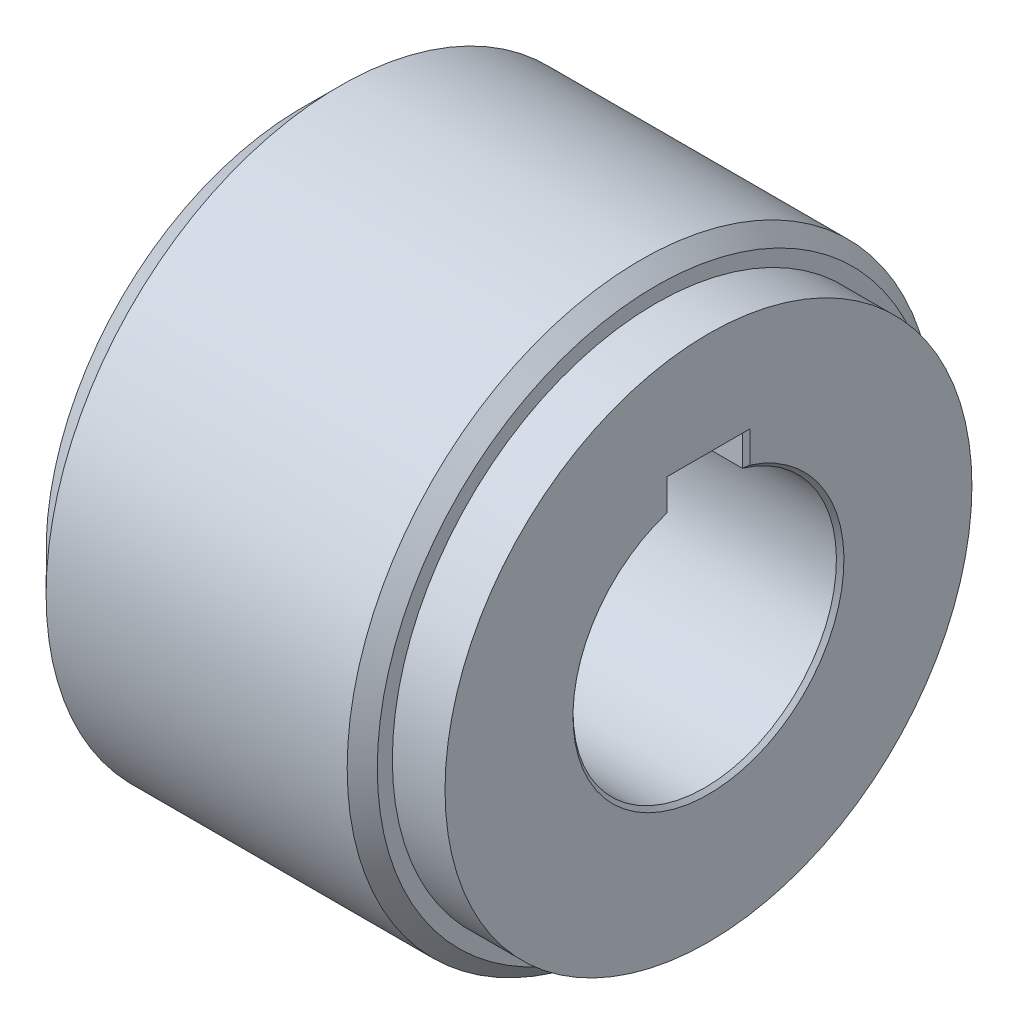
ISO-10303-21;
HEADER;
FILE_DESCRIPTION(('STEP AP214'),'2;1');
FILE_NAME('part.step','',(''),(''),'','','');
FILE_SCHEMA(('AUTOMOTIVE_DESIGN { 1 0 10303 214 1 1 1 1 }'));
ENDSEC;
DATA;
#1=APPLICATION_CONTEXT('core data for automotive mechanical design processes');
#2=APPLICATION_PROTOCOL_DEFINITION('international standard','automotive_design',2000,#1);
#3=PRODUCT_CONTEXT('',#1,'mechanical');
#4=PRODUCT('Part','Part','',(#3));
#5=PRODUCT_RELATED_PRODUCT_CATEGORY('part','',(#4));
#6=PRODUCT_DEFINITION_FORMATION('','',#4);
#7=PRODUCT_DEFINITION_CONTEXT('part definition',#1,'design');
#8=PRODUCT_DEFINITION('design','',#6,#7);
#9=PRODUCT_DEFINITION_SHAPE('','',#8);
#10=(LENGTH_UNIT() NAMED_UNIT(*) SI_UNIT(.MILLI.,.METRE.));
#11=(NAMED_UNIT(*) PLANE_ANGLE_UNIT() SI_UNIT($,.RADIAN.));
#12=(NAMED_UNIT(*) SI_UNIT($,.STERADIAN.) SOLID_ANGLE_UNIT());
#13=UNCERTAINTY_MEASURE_WITH_UNIT(LENGTH_MEASURE(1.E-05),#10,'distance_accuracy_value','');
#14=(GEOMETRIC_REPRESENTATION_CONTEXT(3) GLOBAL_UNCERTAINTY_ASSIGNED_CONTEXT((#13)) GLOBAL_UNIT_ASSIGNED_CONTEXT((#10,
#11,#12)) REPRESENTATION_CONTEXT('',''));
#15=CARTESIAN_POINT('',(0.,0.,0.));
#16=DIRECTION('',(0.,0.,1.));
#17=DIRECTION('',(1.,0.,0.));
#18=AXIS2_PLACEMENT_3D('',#15,#16,#17);
#19=CARTESIAN_POINT('',(27.,0.,0.));
#20=DIRECTION('',(1.,0.,0.));
#21=DIRECTION('',(0.,0.,-1.));
#22=AXIS2_PLACEMENT_3D('',#19,#20,#21);
#23=PLANE('',#22);
#24=DIRECTION('',(0.,0.,-1.));
#25=VECTOR('',#24,1.);
#26=CARTESIAN_POINT('',(27.,21.3,0.));
#27=LINE('',#26,#25);
#28=CARTESIAN_POINT('',(27.,21.3,5.5));
#29=VERTEX_POINT('',#28);
#30=CARTESIAN_POINT('',(27.,21.3,-5.5));
#31=VERTEX_POINT('',#30);
#32=EDGE_CURVE('E157',#29,#31,#27,.T.);
#33=ORIENTED_EDGE('',*,*,#32,.T.);
#34=DIRECTION('',(0.,-1.,0.));
#35=VECTOR('',#34,1.);
#36=CARTESIAN_POINT('',(27.,0.,-5.50000000000001));
#37=LINE('',#36,#35);
#38=CARTESIAN_POINT('',(27.,17.1391365010026,-5.5));
#39=VERTEX_POINT('',#38);
#40=EDGE_CURVE('E159',#31,#39,#37,.T.);
#41=ORIENTED_EDGE('',*,*,#40,.T.);
#42=CARTESIAN_POINT('',(27.,0.,0.));
#43=DIRECTION('',(1.,0.,0.));
#44=DIRECTION('',(0.,0.,-1.));
#45=AXIS2_PLACEMENT_3D('',#42,#43,#44);
#46=CIRCLE('',#45,18.);
#47=CARTESIAN_POINT('',(27.,17.1391365010026,5.5));
#48=VERTEX_POINT('',#47);
#49=EDGE_CURVE('E139',#39,#48,#46,.F.);
#50=ORIENTED_EDGE('',*,*,#49,.T.);
#51=DIRECTION('',(0.,1.,0.));
#52=VECTOR('',#51,1.);
#53=CARTESIAN_POINT('',(27.,0.,5.50000000000001));
#54=LINE('',#53,#52);
#55=EDGE_CURVE('E150',#48,#29,#54,.T.);
#56=ORIENTED_EDGE('',*,*,#55,.T.);
#57=EDGE_LOOP('',(#33,#41,#50,#56));
#58=FACE_BOUND('',#57,.T.);
#59=CARTESIAN_POINT('',(27.,0.,0.));
#60=DIRECTION('',(-1.,0.,0.));
#61=DIRECTION('',(0.,0.,1.));
#62=AXIS2_PLACEMENT_3D('',#59,#60,#61);
#63=CIRCLE('',#62,35.);
#64=CARTESIAN_POINT('',(27.,0.,35.));
#65=VERTEX_POINT('',#64);
#66=EDGE_CURVE('E226',#65,#65,#63,.T.);
#67=ORIENTED_EDGE('',*,*,#66,.F.);
#68=EDGE_LOOP('',(#67));
#69=FACE_BOUND('',#68,.T.);
#70=ADVANCED_FACE('F43',(#58,#69),#23,.T.);
#71=CARTESIAN_POINT('',(27.,0.,0.));
#72=DIRECTION('',(-1.,0.,0.));
#73=DIRECTION('',(0.,0.,1.));
#74=AXIS2_PLACEMENT_3D('',#71,#72,#73);
#75=CYLINDRICAL_SURFACE('',#74,39.);
#76=CARTESIAN_POINT('',(-22.,0.,0.));
#77=DIRECTION('',(1.,0.,0.));
#78=DIRECTION('',(0.,0.,-1.));
#79=AXIS2_PLACEMENT_3D('',#76,#77,#78);
#80=CIRCLE('',#79,39.);
#81=CARTESIAN_POINT('',(-22.,0.,-39.));
#82=VERTEX_POINT('',#81);
#83=EDGE_CURVE('E133',#82,#82,#80,.T.);
#84=ORIENTED_EDGE('',*,*,#83,.T.);
#85=EDGE_LOOP('',(#84));
#86=FACE_BOUND('',#85,.T.);
#87=CARTESIAN_POINT('',(18.,0.,0.));
#88=DIRECTION('',(-1.,0.,0.));
#89=DIRECTION('',(0.,0.,1.));
#90=AXIS2_PLACEMENT_3D('',#87,#88,#89);
#91=CIRCLE('',#90,39.);
#92=CARTESIAN_POINT('',(18.,0.,39.));
#93=VERTEX_POINT('',#92);
#94=EDGE_CURVE('E285',#93,#93,#91,.T.);
#95=ORIENTED_EDGE('',*,*,#94,.T.);
#96=EDGE_LOOP('',(#95));
#97=FACE_BOUND('',#96,.T.);
#98=ADVANCED_FACE('F279',(#86,#97),#75,.T.);
#99=CARTESIAN_POINT('',(-27.,0.,0.));
#100=DIRECTION('',(1.,0.,0.));
#101=DIRECTION('',(0.,0.,-1.));
#102=AXIS2_PLACEMENT_3D('',#99,#100,#101);
#103=PLANE('',#102);
#104=DIRECTION('',(0.,0.,1.));
#105=VECTOR('',#104,1.);
#106=CARTESIAN_POINT('',(-27.,21.3,5.));
#107=LINE('',#106,#105);
#108=CARTESIAN_POINT('',(-27.,21.3,-5.5));
#109=VERTEX_POINT('',#108);
#110=CARTESIAN_POINT('',(-27.,21.3,5.5));
#111=VERTEX_POINT('',#110);
#112=EDGE_CURVE('E53',#109,#111,#107,.T.);
#113=ORIENTED_EDGE('',*,*,#112,.T.);
#114=DIRECTION('',(0.,-1.,0.));
#115=VECTOR('',#114,1.);
#116=CARTESIAN_POINT('',(-27.,16.7705098312484,5.5));
#117=LINE('',#116,#115);
#118=CARTESIAN_POINT('',(-27.,17.1391365010026,5.5));
#119=VERTEX_POINT('',#118);
#120=EDGE_CURVE('E11',#111,#119,#117,.T.);
#121=ORIENTED_EDGE('',*,*,#120,.T.);
#122=CARTESIAN_POINT('',(-27.,0.,0.));
#123=DIRECTION('',(1.,0.,0.));
#124=DIRECTION('',(0.,0.,-1.));
#125=AXIS2_PLACEMENT_3D('',#122,#123,#124);
#126=CIRCLE('',#125,18.);
#127=CARTESIAN_POINT('',(-27.,17.1391365010026,-5.5));
#128=VERTEX_POINT('',#127);
#129=EDGE_CURVE('E121',#119,#128,#126,.T.);
#130=ORIENTED_EDGE('',*,*,#129,.T.);
#131=DIRECTION('',(0.,1.,0.));
#132=VECTOR('',#131,1.);
#133=CARTESIAN_POINT('',(-27.,20.8,-5.5));
#134=LINE('',#133,#132);
#135=EDGE_CURVE('E64',#128,#109,#134,.T.);
#136=ORIENTED_EDGE('',*,*,#135,.T.);
#137=EDGE_LOOP('',(#113,#121,#130,#136));
#138=FACE_BOUND('',#137,.T.);
#139=CARTESIAN_POINT('',(-27.,0.,0.));
#140=DIRECTION('',(1.,0.,0.));
#141=DIRECTION('',(0.,0.,-1.));
#142=AXIS2_PLACEMENT_3D('',#139,#140,#141);
#143=CIRCLE('',#142,34.);
#144=CARTESIAN_POINT('',(-27.,0.,-34.));
#145=VERTEX_POINT('',#144);
#146=EDGE_CURVE('E152',#145,#145,#143,.F.);
#147=ORIENTED_EDGE('',*,*,#146,.T.);
#148=EDGE_LOOP('',(#147));
#149=FACE_BOUND('',#148,.T.);
#150=ADVANCED_FACE('F273',(#138,#149),#103,.F.);
#151=CARTESIAN_POINT('',(27.,0.,0.));
#152=DIRECTION('',(-1.,0.,0.));
#153=DIRECTION('',(0.,0.,1.));
#154=AXIS2_PLACEMENT_3D('',#151,#152,#153);
#155=CYLINDRICAL_SURFACE('',#154,17.5);
#156=DIRECTION('',(-1.,0.,0.));
#157=VECTOR('',#156,1.);
#158=CARTESIAN_POINT('',(27.,16.7705098312484,5.));
#159=LINE('',#158,#157);
#160=CARTESIAN_POINT('',(26.5,16.7705098312484,5.));
#161=VERTEX_POINT('',#160);
#162=CARTESIAN_POINT('',(-26.5,16.7705098312484,5.));
#163=VERTEX_POINT('',#162);
#164=EDGE_CURVE('E116',#161,#163,#159,.T.);
#165=ORIENTED_EDGE('',*,*,#164,.F.);
#166=CARTESIAN_POINT('',(26.5,0.,0.));
#167=DIRECTION('',(1.,0.,0.));
#168=DIRECTION('',(0.,0.,-1.));
#169=AXIS2_PLACEMENT_3D('',#166,#167,#168);
#170=CIRCLE('',#169,17.5);
#171=CARTESIAN_POINT('',(26.5,16.7705098312484,-5.));
#172=VERTEX_POINT('',#171);
#173=EDGE_CURVE('E110',#161,#172,#170,.T.);
#174=ORIENTED_EDGE('',*,*,#173,.T.);
#175=DIRECTION('',(-1.,0.,0.));
#176=VECTOR('',#175,1.);
#177=CARTESIAN_POINT('',(27.,16.7705098312484,-5.));
#178=LINE('',#177,#176);
#179=CARTESIAN_POINT('',(-26.5,16.7705098312484,-5.));
#180=VERTEX_POINT('',#179);
#181=EDGE_CURVE('E113',#172,#180,#178,.T.);
#182=ORIENTED_EDGE('',*,*,#181,.T.);
#183=CARTESIAN_POINT('',(-26.5,0.,0.));
#184=DIRECTION('',(1.,0.,0.));
#185=DIRECTION('',(0.,0.,-1.));
#186=AXIS2_PLACEMENT_3D('',#183,#184,#185);
#187=CIRCLE('',#186,17.5);
#188=EDGE_CURVE('E122',#180,#163,#187,.F.);
#189=ORIENTED_EDGE('',*,*,#188,.T.);
#190=EDGE_LOOP('',(#165,#174,#182,#189));
#191=FACE_BOUND('',#190,.T.);
#192=ADVANCED_FACE('F112',(#191),#155,.F.);
#193=CARTESIAN_POINT('',(27.,20.8,-5.));
#194=DIRECTION('',(0.,0.,1.));
#195=DIRECTION('',(0.,-1.,0.));
#196=AXIS2_PLACEMENT_3D('',#193,#194,#195);
#197=PLANE('',#196);
#198=ORIENTED_EDGE('',*,*,#181,.F.);
#199=DIRECTION('',(0.,1.,0.));
#200=VECTOR('',#199,1.);
#201=CARTESIAN_POINT('',(26.5,20.8,-5.));
#202=LINE('',#201,#200);
#203=CARTESIAN_POINT('',(26.5,20.8,-5.));
#204=VERTEX_POINT('',#203);
#205=EDGE_CURVE('E129',#172,#204,#202,.T.);
#206=ORIENTED_EDGE('',*,*,#205,.T.);
#207=DIRECTION('',(-1.,0.,0.));
#208=VECTOR('',#207,1.);
#209=CARTESIAN_POINT('',(27.,20.8,-5.));
#210=LINE('',#209,#208);
#211=CARTESIAN_POINT('',(-26.5,20.8,-5.));
#212=VERTEX_POINT('',#211);
#213=EDGE_CURVE('E134',#204,#212,#210,.T.);
#214=ORIENTED_EDGE('',*,*,#213,.T.);
#215=DIRECTION('',(0.,-1.,0.));
#216=VECTOR('',#215,1.);
#217=CARTESIAN_POINT('',(-26.5,16.7705098312484,-5.));
#218=LINE('',#217,#216);
#219=EDGE_CURVE('E132',#212,#180,#218,.T.);
#220=ORIENTED_EDGE('',*,*,#219,.T.);
#221=EDGE_LOOP('',(#198,#206,#214,#220));
#222=FACE_BOUND('',#221,.T.);
#223=ADVANCED_FACE('F126',(#222),#197,.T.);
#224=CARTESIAN_POINT('',(27.,20.8,5.));
#225=DIRECTION('',(0.,-1.,0.));
#226=DIRECTION('',(0.,0.,-1.));
#227=AXIS2_PLACEMENT_3D('',#224,#225,#226);
#228=PLANE('',#227);
#229=ORIENTED_EDGE('',*,*,#213,.F.);
#230=DIRECTION('',(0.,0.,1.));
#231=VECTOR('',#230,1.);
#232=CARTESIAN_POINT('',(26.5,20.8,5.));
#233=LINE('',#232,#231);
#234=CARTESIAN_POINT('',(26.5,20.8,5.));
#235=VERTEX_POINT('',#234);
#236=EDGE_CURVE('E163',#204,#235,#233,.T.);
#237=ORIENTED_EDGE('',*,*,#236,.T.);
#238=DIRECTION('',(-1.,0.,0.));
#239=VECTOR('',#238,1.);
#240=CARTESIAN_POINT('',(27.,20.8,5.));
#241=LINE('',#240,#239);
#242=CARTESIAN_POINT('',(-26.5,20.8,5.));
#243=VERTEX_POINT('',#242);
#244=EDGE_CURVE('E261',#235,#243,#241,.T.);
#245=ORIENTED_EDGE('',*,*,#244,.T.);
#246=DIRECTION('',(0.,0.,-1.));
#247=VECTOR('',#246,1.);
#248=CARTESIAN_POINT('',(-26.5,20.8,-5.));
#249=LINE('',#248,#247);
#250=EDGE_CURVE('E161',#243,#212,#249,.T.);
#251=ORIENTED_EDGE('',*,*,#250,.T.);
#252=EDGE_LOOP('',(#229,#237,#245,#251));
#253=FACE_BOUND('',#252,.T.);
#254=ADVANCED_FACE('F263',(#253),#228,.T.);
#255=CARTESIAN_POINT('',(27.,20.8,5.));
#256=DIRECTION('',(0.,0.,-1.));
#257=DIRECTION('',(0.,1.,0.));
#258=AXIS2_PLACEMENT_3D('',#255,#256,#257);
#259=PLANE('',#258);
#260=ORIENTED_EDGE('',*,*,#244,.F.);
#261=DIRECTION('',(0.,-1.,0.));
#262=VECTOR('',#261,1.);
#263=CARTESIAN_POINT('',(26.5,20.8,5.));
#264=LINE('',#263,#262);
#265=EDGE_CURVE('E168',#235,#161,#264,.T.);
#266=ORIENTED_EDGE('',*,*,#265,.T.);
#267=ORIENTED_EDGE('',*,*,#164,.T.);
#268=DIRECTION('',(0.,1.,0.));
#269=VECTOR('',#268,1.);
#270=CARTESIAN_POINT('',(-26.5,20.8,5.));
#271=LINE('',#270,#269);
#272=EDGE_CURVE('E165',#163,#243,#271,.T.);
#273=ORIENTED_EDGE('',*,*,#272,.T.);
#274=EDGE_LOOP('',(#260,#266,#267,#273));
#275=FACE_BOUND('',#274,.T.);
#276=ADVANCED_FACE('F260',(#275),#259,.T.);
#277=CARTESIAN_POINT('',(-22.,0.,0.));
#278=DIRECTION('',(1.,0.,0.));
#279=DIRECTION('',(0.,0.,-1.));
#280=AXIS2_PLACEMENT_3D('',#277,#278,#279);
#281=CONICAL_SURFACE('',#280,39.,0.785398163397449);
#282=ORIENTED_EDGE('',*,*,#146,.F.);
#283=EDGE_LOOP('',(#282));
#284=FACE_BOUND('',#283,.T.);
#285=ORIENTED_EDGE('',*,*,#83,.F.);
#286=EDGE_LOOP('',(#285));
#287=FACE_BOUND('',#286,.T.);
#288=ADVANCED_FACE('F207',(#284,#287),#281,.T.);
#289=CARTESIAN_POINT('',(26.5,20.8,5.));
#290=DIRECTION('',(-0.707106781186548,0.,0.707106781186547));
#291=DIRECTION('',(0.,-1.,0.));
#292=AXIS2_PLACEMENT_3D('',#289,#290,#291);
#293=PLANE('',#292);
#294=DIRECTION('',(0.577350269189625,0.577350269189627,0.577350269189626));
#295=VECTOR('',#294,1.);
#296=CARTESIAN_POINT('',(26.5,20.8,5.));
#297=LINE('',#296,#295);
#298=EDGE_CURVE('E143',#29,#235,#297,.F.);
#299=ORIENTED_EDGE('',*,*,#298,.F.);
#300=ORIENTED_EDGE('',*,*,#55,.F.);
#301=CARTESIAN_POINT('',(26.5,16.7705098312484,5.));
#302=CARTESIAN_POINT('',(26.5831397554342,16.832472762291,5.08313975543422));
#303=CARTESIAN_POINT('',(26.6663763027381,16.894173119088,5.16637630273812));
#304=CARTESIAN_POINT('',(26.8330429694319,17.0170486755993,5.33304296943186));
#305=CARTESIAN_POINT('',(26.9164730887946,17.078223875387,5.41647308879463));
#306=CARTESIAN_POINT('',(27.,17.1391365010026,5.5));
#307=B_SPLINE_CURVE_WITH_KNOTS('',3,(#301,#302,#303,#304,#305,#306),.UNSPECIFIED.,.F.,.F.,(4,2,
4),(0.,0.398713201169975,0.797426346583545),.UNSPECIFIED.);
#308=EDGE_CURVE('E213',#161,#48,#307,.T.);
#309=ORIENTED_EDGE('',*,*,#308,.F.);
#310=ORIENTED_EDGE('',*,*,#265,.F.);
#311=EDGE_LOOP('',(#299,#300,#309,#310));
#312=FACE_BOUND('',#311,.T.);
#313=ADVANCED_FACE('F200',(#312),#293,.F.);
#314=CARTESIAN_POINT('',(26.5,0.,0.));
#315=DIRECTION('',(1.,0.,0.));
#316=DIRECTION('',(0.,0.,-1.));
#317=AXIS2_PLACEMENT_3D('',#314,#315,#316);
#318=CONICAL_SURFACE('',#317,17.5,0.785398163397448);
#319=ORIENTED_EDGE('',*,*,#308,.T.);
#320=ORIENTED_EDGE('',*,*,#49,.F.);
#321=CARTESIAN_POINT('',(27.,17.1391365010026,-5.5));
#322=CARTESIAN_POINT('',(26.9164730887946,17.078223875387,-5.41647308879463));
#323=CARTESIAN_POINT('',(26.8330429694319,17.0170486755993,-5.33304296943186));
#324=CARTESIAN_POINT('',(26.6663763027381,16.894173119088,-5.16637630273812));
#325=CARTESIAN_POINT('',(26.5831397554342,16.832472762291,-5.08313975543422));
#326=CARTESIAN_POINT('',(26.5,16.7705098312484,-5.));
#327=B_SPLINE_CURVE_WITH_KNOTS('',3,(#321,#322,#323,#324,#325,#326),.UNSPECIFIED.,.F.,.F.,(4,2,
4),(0.,0.398713145413568,0.797426346583542),.UNSPECIFIED.);
#328=EDGE_CURVE('E137',#172,#39,#327,.F.);
#329=ORIENTED_EDGE('',*,*,#328,.F.);
#330=ORIENTED_EDGE('',*,*,#173,.F.);
#331=EDGE_LOOP('',(#319,#320,#329,#330));
#332=FACE_BOUND('',#331,.T.);
#333=ADVANCED_FACE('F138',(#332),#318,.F.);
#334=CARTESIAN_POINT('',(26.5,20.8,5.));
#335=DIRECTION('',(-0.707106781186549,0.707106781186546,0.));
#336=DIRECTION('',(0.,0.,1.));
#337=AXIS2_PLACEMENT_3D('',#334,#335,#336);
#338=PLANE('',#337);
#339=ORIENTED_EDGE('',*,*,#298,.T.);
#340=ORIENTED_EDGE('',*,*,#236,.F.);
#341=DIRECTION('',(0.577350269189626,0.577350269189628,-0.577350269189624));
#342=VECTOR('',#341,1.);
#343=CARTESIAN_POINT('',(26.5,20.8,-5.));
#344=LINE('',#343,#342);
#345=EDGE_CURVE('E144',#31,#204,#344,.F.);
#346=ORIENTED_EDGE('',*,*,#345,.F.);
#347=ORIENTED_EDGE('',*,*,#32,.F.);
#348=EDGE_LOOP('',(#339,#340,#346,#347));
#349=FACE_BOUND('',#348,.T.);
#350=ADVANCED_FACE('F193',(#349),#338,.F.);
#351=CARTESIAN_POINT('',(26.5,20.8,-5.));
#352=DIRECTION('',(-0.707106781186547,0.,-0.707106781186548));
#353=DIRECTION('',(0.,1.,0.));
#354=AXIS2_PLACEMENT_3D('',#351,#352,#353);
#355=PLANE('',#354);
#356=ORIENTED_EDGE('',*,*,#328,.T.);
#357=ORIENTED_EDGE('',*,*,#40,.F.);
#358=ORIENTED_EDGE('',*,*,#345,.T.);
#359=ORIENTED_EDGE('',*,*,#205,.F.);
#360=EDGE_LOOP('',(#356,#357,#358,#359));
#361=FACE_BOUND('',#360,.T.);
#362=ADVANCED_FACE('F146',(#361),#355,.F.);
#363=CARTESIAN_POINT('',(-27.,0.,-5.50000000000001));
#364=DIRECTION('',(-0.707106781186547,0.,0.707106781186548));
#365=DIRECTION('',(0.,-1.,0.));
#366=AXIS2_PLACEMENT_3D('',#363,#364,#365);
#367=PLANE('',#366);
#368=CARTESIAN_POINT('',(-26.5,16.7705098312484,-5.));
#369=CARTESIAN_POINT('',(-26.5831397554342,16.832472762291,-5.08313975543422));
#370=CARTESIAN_POINT('',(-26.6663763027381,16.894173119088,-5.16637630273812));
#371=CARTESIAN_POINT('',(-26.8330429694319,17.0170486755993,-5.33304296943186));
#372=CARTESIAN_POINT('',(-26.9164730887946,17.078223875387,-5.41647308879463));
#373=CARTESIAN_POINT('',(-27.,17.1391365010026,-5.5));
#374=B_SPLINE_CURVE_WITH_KNOTS('',3,(#368,#369,#370,#371,#372,#373),.UNSPECIFIED.,.F.,.F.,(4,2,
4),(0.,0.398713201169974,0.797426346583544),.UNSPECIFIED.);
#375=EDGE_CURVE('E241',#180,#128,#374,.T.);
#376=ORIENTED_EDGE('',*,*,#375,.F.);
#377=ORIENTED_EDGE('',*,*,#219,.F.);
#378=DIRECTION('',(-0.577350269189626,0.577350269189628,-0.577350269189624));
#379=VECTOR('',#378,1.);
#380=CARTESIAN_POINT('',(-25.1666666666667,19.4666666666667,-3.66666666666668));
#381=LINE('',#380,#379);
#382=EDGE_CURVE('E48',#109,#212,#381,.F.);
#383=ORIENTED_EDGE('',*,*,#382,.F.);
#384=ORIENTED_EDGE('',*,*,#135,.F.);
#385=EDGE_LOOP('',(#376,#377,#383,#384));
#386=FACE_BOUND('',#385,.T.);
#387=ADVANCED_FACE('F192',(#386),#367,.T.);
#388=CARTESIAN_POINT('',(-27.,21.3,0.));
#389=DIRECTION('',(-0.707106781186549,-0.707106781186546,0.));
#390=DIRECTION('',(0.,0.,-1.));
#391=AXIS2_PLACEMENT_3D('',#388,#389,#390);
#392=PLANE('',#391);
#393=ORIENTED_EDGE('',*,*,#382,.T.);
#394=ORIENTED_EDGE('',*,*,#250,.F.);
#395=DIRECTION('',(-0.577350269189625,0.577350269189627,0.577350269189626));
#396=VECTOR('',#395,1.);
#397=CARTESIAN_POINT('',(-19.9,14.2,-1.60000000000001));
#398=LINE('',#397,#396);
#399=EDGE_CURVE('E225',#111,#243,#398,.F.);
#400=ORIENTED_EDGE('',*,*,#399,.F.);
#401=ORIENTED_EDGE('',*,*,#112,.F.);
#402=EDGE_LOOP('',(#393,#394,#400,#401));
#403=FACE_BOUND('',#402,.T.);
#404=ADVANCED_FACE('F46',(#403),#392,.T.);
#405=CARTESIAN_POINT('',(-27.,0.,0.));
#406=DIRECTION('',(-1.,0.,0.));
#407=DIRECTION('',(0.,0.,1.));
#408=AXIS2_PLACEMENT_3D('',#405,#406,#407);
#409=CONICAL_SURFACE('',#408,18.,0.785398163397448);
#410=ORIENTED_EDGE('',*,*,#375,.T.);
#411=ORIENTED_EDGE('',*,*,#129,.F.);
#412=CARTESIAN_POINT('',(-27.,17.1391365010026,5.5));
#413=CARTESIAN_POINT('',(-26.9164730887946,17.078223875387,5.41647308879463));
#414=CARTESIAN_POINT('',(-26.8330429694319,17.0170486755993,5.33304296943186));
#415=CARTESIAN_POINT('',(-26.6663763027381,16.894173119088,5.16637630273812));
#416=CARTESIAN_POINT('',(-26.5831397554342,16.832472762291,5.08313975543422));
#417=CARTESIAN_POINT('',(-26.5,16.7705098312484,5.));
#418=B_SPLINE_CURVE_WITH_KNOTS('',3,(#412,#413,#414,#415,#416,#417),.UNSPECIFIED.,.F.,.F.,(4,2,
4),(0.,0.398713145413571,0.797426346583544),.UNSPECIFIED.);
#419=EDGE_CURVE('E219',#163,#119,#418,.F.);
#420=ORIENTED_EDGE('',*,*,#419,.F.);
#421=ORIENTED_EDGE('',*,*,#188,.F.);
#422=EDGE_LOOP('',(#410,#411,#420,#421));
#423=FACE_BOUND('',#422,.T.);
#424=ADVANCED_FACE('F210',(#423),#409,.F.);
#425=CARTESIAN_POINT('',(-27.,0.,5.50000000000001));
#426=DIRECTION('',(-0.707106781186548,0.,-0.707106781186547));
#427=DIRECTION('',(0.,1.,0.));
#428=AXIS2_PLACEMENT_3D('',#425,#426,#427);
#429=PLANE('',#428);
#430=ORIENTED_EDGE('',*,*,#399,.T.);
#431=ORIENTED_EDGE('',*,*,#272,.F.);
#432=ORIENTED_EDGE('',*,*,#419,.T.);
#433=ORIENTED_EDGE('',*,*,#120,.F.);
#434=EDGE_LOOP('',(#430,#431,#432,#433));
#435=FACE_BOUND('',#434,.T.);
#436=ADVANCED_FACE('F228',(#435),#429,.T.);
#437=CARTESIAN_POINT('',(0.,0.,0.));
#438=DIRECTION('',(-1.,0.,0.));
#439=DIRECTION('',(0.,0.,1.));
#440=AXIS2_PLACEMENT_3D('',#437,#438,#439);
#441=CYLINDRICAL_SURFACE('',#440,35.);
#442=ORIENTED_EDGE('',*,*,#66,.T.);
#443=EDGE_LOOP('',(#442));
#444=FACE_BOUND('',#443,.T.);
#445=CARTESIAN_POINT('',(20.,0.,0.));
#446=DIRECTION('',(-1.,0.,0.));
#447=DIRECTION('',(0.,0.,1.));
#448=AXIS2_PLACEMENT_3D('',#445,#446,#447);
#449=CIRCLE('',#448,35.);
#450=CARTESIAN_POINT('',(20.,0.,35.));
#451=VERTEX_POINT('',#450);
#452=EDGE_CURVE('E290',#451,#451,#449,.T.);
#453=ORIENTED_EDGE('',*,*,#452,.F.);
#454=EDGE_LOOP('',(#453));
#455=FACE_BOUND('',#454,.T.);
#456=ADVANCED_FACE('F234',(#444,#455),#441,.T.);
#457=CARTESIAN_POINT('',(20.,35.,0.));
#458=DIRECTION('',(1.,0.,0.));
#459=DIRECTION('',(0.,0.,-1.));
#460=AXIS2_PLACEMENT_3D('',#457,#458,#459);
#461=PLANE('',#460);
#462=ORIENTED_EDGE('',*,*,#452,.T.);
#463=EDGE_LOOP('',(#462));
#464=FACE_BOUND('',#463,.T.);
#465=CARTESIAN_POINT('',(20.,0.,0.));
#466=DIRECTION('',(-1.,0.,0.));
#467=DIRECTION('',(0.,0.,1.));
#468=AXIS2_PLACEMENT_3D('',#465,#466,#467);
#469=CIRCLE('',#468,37.);
#470=CARTESIAN_POINT('',(20.,0.,37.));
#471=VERTEX_POINT('',#470);
#472=EDGE_CURVE('E287',#471,#471,#469,.T.);
#473=ORIENTED_EDGE('',*,*,#472,.F.);
#474=EDGE_LOOP('',(#473));
#475=FACE_BOUND('',#474,.T.);
#476=ADVANCED_FACE('F325',(#464,#475),#461,.T.);
#477=CARTESIAN_POINT('',(18.,0.,0.));
#478=DIRECTION('',(-1.,0.,0.));
#479=DIRECTION('',(0.,0.,1.));
#480=AXIS2_PLACEMENT_3D('',#477,#478,#479);
#481=CONICAL_SURFACE('',#480,39.,0.785398163397442);
#482=ORIENTED_EDGE('',*,*,#472,.T.);
#483=EDGE_LOOP('',(#482));
#484=FACE_BOUND('',#483,.T.);
#485=ORIENTED_EDGE('',*,*,#94,.F.);
#486=EDGE_LOOP('',(#485));
#487=FACE_BOUND('',#486,.T.);
#488=ADVANCED_FACE('F328',(#484,#487),#481,.T.);
#489=CLOSED_SHELL('',(#70,#98,#150,#192,#223,#254,#276,#288,#313,#333,#350,#362,#387,#404,#424,
#436,#456,#476,#488));
#490=MANIFOLD_SOLID_BREP('B2',#489);
#491=ADVANCED_BREP_SHAPE_REPRESENTATION('',(#18,#490),#14);
#492=SHAPE_DEFINITION_REPRESENTATION(#9,#491);
ENDSEC;
END-ISO-10303-21;
